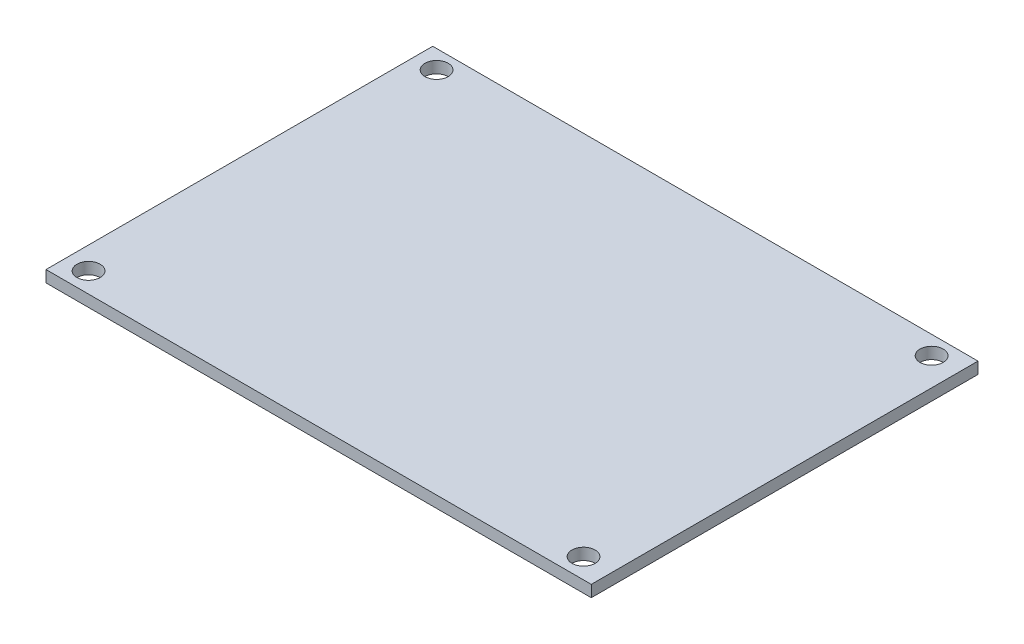
ISO-10303-21;
HEADER;
FILE_DESCRIPTION(('STEP AP214'),'2;1');
FILE_NAME('part.step','',(''),(''),'','','');
FILE_SCHEMA(('AUTOMOTIVE_DESIGN { 1 0 10303 214 1 1 1 1 }'));
ENDSEC;
DATA;
#1=APPLICATION_CONTEXT('core data for automotive mechanical design processes');
#2=APPLICATION_PROTOCOL_DEFINITION('international standard','automotive_design',2000,#1);
#3=PRODUCT_CONTEXT('',#1,'mechanical');
#4=PRODUCT('Part','Part','',(#3));
#5=PRODUCT_RELATED_PRODUCT_CATEGORY('part','',(#4));
#6=PRODUCT_DEFINITION_FORMATION('','',#4);
#7=PRODUCT_DEFINITION_CONTEXT('part definition',#1,'design');
#8=PRODUCT_DEFINITION('design','',#6,#7);
#9=PRODUCT_DEFINITION_SHAPE('','',#8);
#10=(LENGTH_UNIT() NAMED_UNIT(*) SI_UNIT(.MILLI.,.METRE.));
#11=(NAMED_UNIT(*) PLANE_ANGLE_UNIT() SI_UNIT($,.RADIAN.));
#12=(NAMED_UNIT(*) SI_UNIT($,.STERADIAN.) SOLID_ANGLE_UNIT());
#13=UNCERTAINTY_MEASURE_WITH_UNIT(LENGTH_MEASURE(1.E-05),#10,'distance_accuracy_value','');
#14=(GEOMETRIC_REPRESENTATION_CONTEXT(3) GLOBAL_UNCERTAINTY_ASSIGNED_CONTEXT((#13)) GLOBAL_UNIT_ASSIGNED_CONTEXT((#10,
#11,#12)) REPRESENTATION_CONTEXT('',''));
#15=CARTESIAN_POINT('',(0.,0.,0.));
#16=DIRECTION('',(0.,0.,1.));
#17=DIRECTION('',(1.,0.,0.));
#18=AXIS2_PLACEMENT_3D('',#15,#16,#17);
#19=CARTESIAN_POINT('',(0.,1.5,0.));
#20=DIRECTION('',(0.,1.,0.));
#21=DIRECTION('',(0.,0.,1.));
#22=AXIS2_PLACEMENT_3D('',#19,#20,#21);
#23=PLANE('',#22);
#24=CARTESIAN_POINT('',(31.65,1.5,-22.6));
#25=DIRECTION('',(0.,1.,0.));
#26=DIRECTION('',(0.,0.,1.));
#27=AXIS2_PLACEMENT_3D('',#24,#25,#26);
#28=CIRCLE('',#27,1.5);
#29=CARTESIAN_POINT('',(31.65,1.5,-21.1));
#30=VERTEX_POINT('',#29);
#31=EDGE_CURVE('E123',#30,#30,#28,.T.);
#32=ORIENTED_EDGE('',*,*,#31,.F.);
#33=EDGE_LOOP('',(#32));
#34=FACE_BOUND('',#33,.T.);
#35=CARTESIAN_POINT('',(-32.35,1.5,-22.6));
#36=DIRECTION('',(0.,1.,0.));
#37=DIRECTION('',(0.,0.,1.));
#38=AXIS2_PLACEMENT_3D('',#35,#36,#37);
#39=CIRCLE('',#38,1.5);
#40=CARTESIAN_POINT('',(-32.35,1.5,-21.1));
#41=VERTEX_POINT('',#40);
#42=EDGE_CURVE('E102',#41,#41,#39,.T.);
#43=ORIENTED_EDGE('',*,*,#42,.F.);
#44=EDGE_LOOP('',(#43));
#45=FACE_BOUND('',#44,.T.);
#46=DIRECTION('',(0.,0.,-1.));
#47=VECTOR('',#46,1.);
#48=CARTESIAN_POINT('',(35.25,1.5,-25.));
#49=LINE('',#48,#47);
#50=CARTESIAN_POINT('',(35.25,1.5,25.));
#51=VERTEX_POINT('',#50);
#52=CARTESIAN_POINT('',(35.25,1.5,-25.));
#53=VERTEX_POINT('',#52);
#54=EDGE_CURVE('E87',#51,#53,#49,.T.);
#55=ORIENTED_EDGE('',*,*,#54,.T.);
#56=DIRECTION('',(-1.,0.,0.));
#57=VECTOR('',#56,1.);
#58=CARTESIAN_POINT('',(-35.25,1.5,-25.));
#59=LINE('',#58,#57);
#60=CARTESIAN_POINT('',(-35.25,1.5,-25.));
#61=VERTEX_POINT('',#60);
#62=EDGE_CURVE('E82',#53,#61,#59,.T.);
#63=ORIENTED_EDGE('',*,*,#62,.T.);
#64=DIRECTION('',(0.,0.,1.));
#65=VECTOR('',#64,1.);
#66=CARTESIAN_POINT('',(-35.25,1.5,-25.));
#67=LINE('',#66,#65);
#68=CARTESIAN_POINT('',(-35.25,1.5,25.));
#69=VERTEX_POINT('',#68);
#70=EDGE_CURVE('E85',#61,#69,#67,.T.);
#71=ORIENTED_EDGE('',*,*,#70,.T.);
#72=DIRECTION('',(1.,0.,0.));
#73=VECTOR('',#72,1.);
#74=CARTESIAN_POINT('',(-35.25,1.5,25.));
#75=LINE('',#74,#73);
#76=EDGE_CURVE('E52',#69,#51,#75,.T.);
#77=ORIENTED_EDGE('',*,*,#76,.T.);
#78=EDGE_LOOP('',(#55,#63,#71,#77));
#79=FACE_BOUND('',#78,.T.);
#80=CARTESIAN_POINT('',(-32.35,1.5,22.4));
#81=DIRECTION('',(0.,1.,0.));
#82=DIRECTION('',(0.,0.,1.));
#83=AXIS2_PLACEMENT_3D('',#80,#81,#82);
#84=CIRCLE('',#83,1.5);
#85=CARTESIAN_POINT('',(-32.35,1.5,23.9));
#86=VERTEX_POINT('',#85);
#87=EDGE_CURVE('E117',#86,#86,#84,.T.);
#88=ORIENTED_EDGE('',*,*,#87,.F.);
#89=EDGE_LOOP('',(#88));
#90=FACE_BOUND('',#89,.T.);
#91=CARTESIAN_POINT('',(31.65,1.5,22.4));
#92=DIRECTION('',(0.,1.,0.));
#93=DIRECTION('',(0.,0.,1.));
#94=AXIS2_PLACEMENT_3D('',#91,#92,#93);
#95=CIRCLE('',#94,1.5);
#96=CARTESIAN_POINT('',(31.65,1.5,23.9));
#97=VERTEX_POINT('',#96);
#98=EDGE_CURVE('E129',#97,#97,#95,.T.);
#99=ORIENTED_EDGE('',*,*,#98,.F.);
#100=EDGE_LOOP('',(#99));
#101=FACE_BOUND('',#100,.T.);
#102=ADVANCED_FACE('F35',(#34,#45,#79,#90,#101),#23,.T.);
#103=CARTESIAN_POINT('',(0.,0.,0.));
#104=DIRECTION('',(0.,1.,0.));
#105=DIRECTION('',(0.,0.,1.));
#106=AXIS2_PLACEMENT_3D('',#103,#104,#105);
#107=PLANE('',#106);
#108=DIRECTION('',(0.,0.,-1.));
#109=VECTOR('',#108,1.);
#110=CARTESIAN_POINT('',(35.25,0.,-25.));
#111=LINE('',#110,#109);
#112=CARTESIAN_POINT('',(35.25,0.,25.));
#113=VERTEX_POINT('',#112);
#114=CARTESIAN_POINT('',(35.25,0.,-25.));
#115=VERTEX_POINT('',#114);
#116=EDGE_CURVE('E99',#113,#115,#111,.T.);
#117=ORIENTED_EDGE('',*,*,#116,.F.);
#118=DIRECTION('',(1.,0.,0.));
#119=VECTOR('',#118,1.);
#120=CARTESIAN_POINT('',(-35.25,0.,25.));
#121=LINE('',#120,#119);
#122=CARTESIAN_POINT('',(-35.25,0.,25.));
#123=VERTEX_POINT('',#122);
#124=EDGE_CURVE('E75',#123,#113,#121,.T.);
#125=ORIENTED_EDGE('',*,*,#124,.F.);
#126=DIRECTION('',(0.,0.,1.));
#127=VECTOR('',#126,1.);
#128=CARTESIAN_POINT('',(-35.25,0.,-25.));
#129=LINE('',#128,#127);
#130=CARTESIAN_POINT('',(-35.25,0.,-25.));
#131=VERTEX_POINT('',#130);
#132=EDGE_CURVE('E69',#131,#123,#129,.T.);
#133=ORIENTED_EDGE('',*,*,#132,.F.);
#134=DIRECTION('',(-1.,0.,0.));
#135=VECTOR('',#134,1.);
#136=CARTESIAN_POINT('',(-35.25,0.,-25.));
#137=LINE('',#136,#135);
#138=EDGE_CURVE('E91',#115,#131,#137,.T.);
#139=ORIENTED_EDGE('',*,*,#138,.F.);
#140=EDGE_LOOP('',(#117,#125,#133,#139));
#141=FACE_BOUND('',#140,.T.);
#142=CARTESIAN_POINT('',(-32.35,0.,-22.6));
#143=DIRECTION('',(0.,1.,0.));
#144=DIRECTION('',(0.,0.,1.));
#145=AXIS2_PLACEMENT_3D('',#142,#143,#144);
#146=CIRCLE('',#145,1.5);
#147=CARTESIAN_POINT('',(-32.35,0.,-21.1));
#148=VERTEX_POINT('',#147);
#149=EDGE_CURVE('E114',#148,#148,#146,.T.);
#150=ORIENTED_EDGE('',*,*,#149,.T.);
#151=EDGE_LOOP('',(#150));
#152=FACE_BOUND('',#151,.T.);
#153=CARTESIAN_POINT('',(-32.35,0.,22.4));
#154=DIRECTION('',(0.,1.,0.));
#155=DIRECTION('',(0.,0.,1.));
#156=AXIS2_PLACEMENT_3D('',#153,#154,#155);
#157=CIRCLE('',#156,1.5);
#158=CARTESIAN_POINT('',(-32.35,0.,23.9));
#159=VERTEX_POINT('',#158);
#160=EDGE_CURVE('E120',#159,#159,#157,.T.);
#161=ORIENTED_EDGE('',*,*,#160,.T.);
#162=EDGE_LOOP('',(#161));
#163=FACE_BOUND('',#162,.T.);
#164=CARTESIAN_POINT('',(31.65,0.,-22.6));
#165=DIRECTION('',(0.,1.,0.));
#166=DIRECTION('',(0.,0.,1.));
#167=AXIS2_PLACEMENT_3D('',#164,#165,#166);
#168=CIRCLE('',#167,1.5);
#169=CARTESIAN_POINT('',(31.65,0.,-21.1));
#170=VERTEX_POINT('',#169);
#171=EDGE_CURVE('E126',#170,#170,#168,.T.);
#172=ORIENTED_EDGE('',*,*,#171,.T.);
#173=EDGE_LOOP('',(#172));
#174=FACE_BOUND('',#173,.T.);
#175=CARTESIAN_POINT('',(31.65,0.,22.4));
#176=DIRECTION('',(0.,1.,0.));
#177=DIRECTION('',(0.,0.,1.));
#178=AXIS2_PLACEMENT_3D('',#175,#176,#177);
#179=CIRCLE('',#178,1.5);
#180=CARTESIAN_POINT('',(31.65,0.,23.9));
#181=VERTEX_POINT('',#180);
#182=EDGE_CURVE('E132',#181,#181,#179,.T.);
#183=ORIENTED_EDGE('',*,*,#182,.T.);
#184=EDGE_LOOP('',(#183));
#185=FACE_BOUND('',#184,.T.);
#186=ADVANCED_FACE('F110',(#141,#152,#163,#174,#185),#107,.F.);
#187=CARTESIAN_POINT('',(35.25,1.5,-25.));
#188=DIRECTION('',(-1.,0.,0.));
#189=DIRECTION('',(0.,0.,1.));
#190=AXIS2_PLACEMENT_3D('',#187,#188,#189);
#191=PLANE('',#190);
#192=ORIENTED_EDGE('',*,*,#116,.T.);
#193=DIRECTION('',(0.,-1.,0.));
#194=VECTOR('',#193,1.);
#195=CARTESIAN_POINT('',(35.25,1.5,-25.));
#196=LINE('',#195,#194);
#197=EDGE_CURVE('E11',#53,#115,#196,.T.);
#198=ORIENTED_EDGE('',*,*,#197,.F.);
#199=ORIENTED_EDGE('',*,*,#54,.F.);
#200=DIRECTION('',(0.,-1.,0.));
#201=VECTOR('',#200,1.);
#202=CARTESIAN_POINT('',(35.25,1.5,25.));
#203=LINE('',#202,#201);
#204=EDGE_CURVE('E95',#51,#113,#203,.T.);
#205=ORIENTED_EDGE('',*,*,#204,.T.);
#206=EDGE_LOOP('',(#192,#198,#199,#205));
#207=FACE_BOUND('',#206,.T.);
#208=ADVANCED_FACE('F37',(#207),#191,.F.);
#209=CARTESIAN_POINT('',(-35.25,1.5,-25.));
#210=DIRECTION('',(0.,0.,1.));
#211=DIRECTION('',(1.,0.,0.));
#212=AXIS2_PLACEMENT_3D('',#209,#210,#211);
#213=PLANE('',#212);
#214=ORIENTED_EDGE('',*,*,#138,.T.);
#215=DIRECTION('',(0.,-1.,0.));
#216=VECTOR('',#215,1.);
#217=CARTESIAN_POINT('',(-35.25,1.5,-25.));
#218=LINE('',#217,#216);
#219=EDGE_CURVE('E44',#61,#131,#218,.T.);
#220=ORIENTED_EDGE('',*,*,#219,.F.);
#221=ORIENTED_EDGE('',*,*,#62,.F.);
#222=ORIENTED_EDGE('',*,*,#197,.T.);
#223=EDGE_LOOP('',(#214,#220,#221,#222));
#224=FACE_BOUND('',#223,.T.);
#225=ADVANCED_FACE('F90',(#224),#213,.F.);
#226=CARTESIAN_POINT('',(-35.25,1.5,-25.));
#227=DIRECTION('',(1.,0.,0.));
#228=DIRECTION('',(0.,0.,-1.));
#229=AXIS2_PLACEMENT_3D('',#226,#227,#228);
#230=PLANE('',#229);
#231=ORIENTED_EDGE('',*,*,#132,.T.);
#232=DIRECTION('',(0.,-1.,0.));
#233=VECTOR('',#232,1.);
#234=CARTESIAN_POINT('',(-35.25,1.5,25.));
#235=LINE('',#234,#233);
#236=EDGE_CURVE('E92',#69,#123,#235,.T.);
#237=ORIENTED_EDGE('',*,*,#236,.F.);
#238=ORIENTED_EDGE('',*,*,#70,.F.);
#239=ORIENTED_EDGE('',*,*,#219,.T.);
#240=EDGE_LOOP('',(#231,#237,#238,#239));
#241=FACE_BOUND('',#240,.T.);
#242=ADVANCED_FACE('F93',(#241),#230,.F.);
#243=CARTESIAN_POINT('',(-35.25,1.5,25.));
#244=DIRECTION('',(0.,0.,-1.));
#245=DIRECTION('',(-1.,0.,0.));
#246=AXIS2_PLACEMENT_3D('',#243,#244,#245);
#247=PLANE('',#246);
#248=ORIENTED_EDGE('',*,*,#124,.T.);
#249=ORIENTED_EDGE('',*,*,#204,.F.);
#250=ORIENTED_EDGE('',*,*,#76,.F.);
#251=ORIENTED_EDGE('',*,*,#236,.T.);
#252=EDGE_LOOP('',(#248,#249,#250,#251));
#253=FACE_BOUND('',#252,.T.);
#254=ADVANCED_FACE('F107',(#253),#247,.F.);
#255=CARTESIAN_POINT('',(-32.35,1.5,-22.6));
#256=DIRECTION('',(0.,-1.,0.));
#257=DIRECTION('',(0.,0.,-1.));
#258=AXIS2_PLACEMENT_3D('',#255,#256,#257);
#259=CYLINDRICAL_SURFACE('',#258,1.5);
#260=ORIENTED_EDGE('',*,*,#42,.T.);
#261=EDGE_LOOP('',(#260));
#262=FACE_BOUND('',#261,.T.);
#263=ORIENTED_EDGE('',*,*,#149,.F.);
#264=EDGE_LOOP('',(#263));
#265=FACE_BOUND('',#264,.T.);
#266=ADVANCED_FACE('F151',(#262,#265),#259,.F.);
#267=CARTESIAN_POINT('',(-32.35,1.5,22.4));
#268=DIRECTION('',(0.,-1.,0.));
#269=DIRECTION('',(0.,0.,-1.));
#270=AXIS2_PLACEMENT_3D('',#267,#268,#269);
#271=CYLINDRICAL_SURFACE('',#270,1.5);
#272=ORIENTED_EDGE('',*,*,#87,.T.);
#273=EDGE_LOOP('',(#272));
#274=FACE_BOUND('',#273,.T.);
#275=ORIENTED_EDGE('',*,*,#160,.F.);
#276=EDGE_LOOP('',(#275));
#277=FACE_BOUND('',#276,.T.);
#278=ADVANCED_FACE('F197',(#274,#277),#271,.F.);
#279=CARTESIAN_POINT('',(31.65,1.5,-22.6));
#280=DIRECTION('',(0.,-1.,0.));
#281=DIRECTION('',(0.,0.,-1.));
#282=AXIS2_PLACEMENT_3D('',#279,#280,#281);
#283=CYLINDRICAL_SURFACE('',#282,1.5);
#284=ORIENTED_EDGE('',*,*,#31,.T.);
#285=EDGE_LOOP('',(#284));
#286=FACE_BOUND('',#285,.T.);
#287=ORIENTED_EDGE('',*,*,#171,.F.);
#288=EDGE_LOOP('',(#287));
#289=FACE_BOUND('',#288,.T.);
#290=ADVANCED_FACE('F205',(#286,#289),#283,.F.);
#291=CARTESIAN_POINT('',(31.65,1.5,22.4));
#292=DIRECTION('',(0.,-1.,0.));
#293=DIRECTION('',(0.,0.,-1.));
#294=AXIS2_PLACEMENT_3D('',#291,#292,#293);
#295=CYLINDRICAL_SURFACE('',#294,1.5);
#296=ORIENTED_EDGE('',*,*,#98,.T.);
#297=EDGE_LOOP('',(#296));
#298=FACE_BOUND('',#297,.T.);
#299=ORIENTED_EDGE('',*,*,#182,.F.);
#300=EDGE_LOOP('',(#299));
#301=FACE_BOUND('',#300,.T.);
#302=ADVANCED_FACE('F138',(#298,#301),#295,.F.);
#303=CLOSED_SHELL('',(#102,#186,#208,#225,#242,#254,#266,#278,#290,#302));
#304=MANIFOLD_SOLID_BREP('B2',#303);
#305=ADVANCED_BREP_SHAPE_REPRESENTATION('',(#18,#304),#14);
#306=SHAPE_DEFINITION_REPRESENTATION(#9,#305);
ENDSEC;
END-ISO-10303-21;
